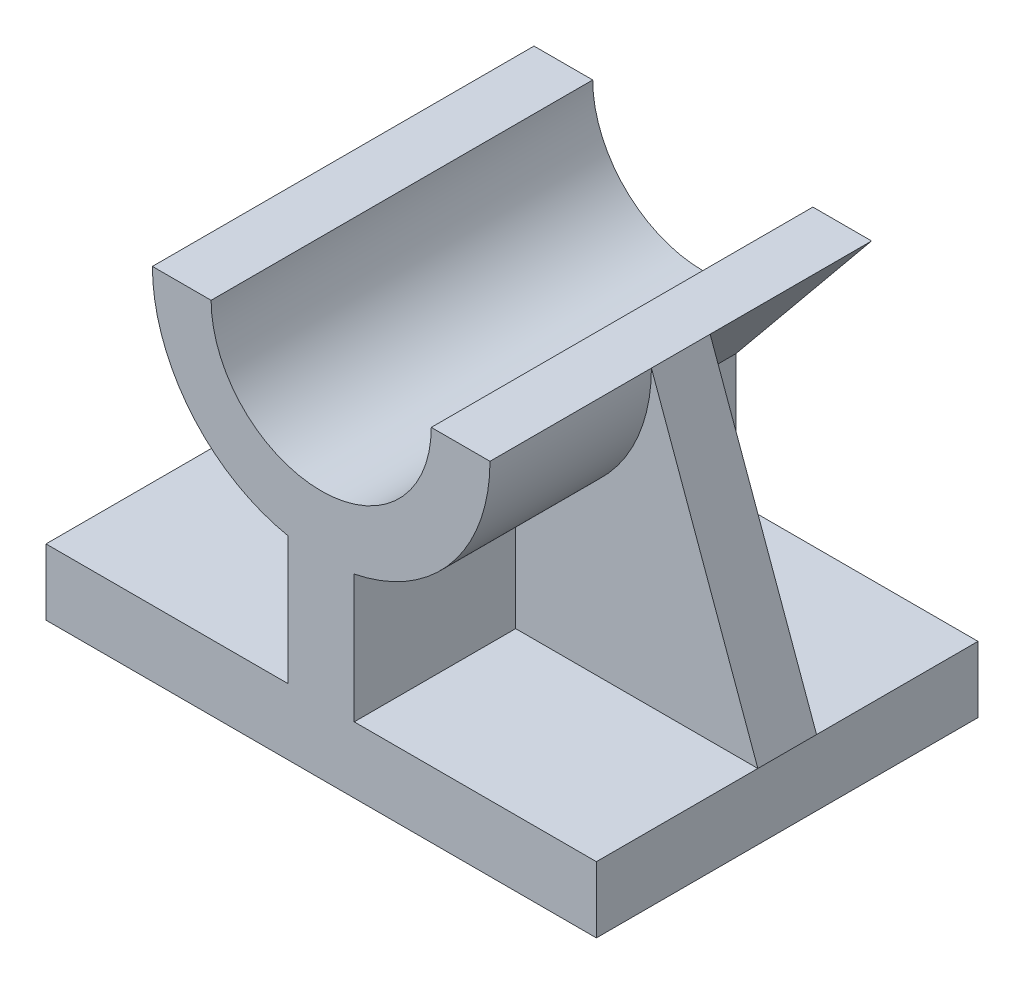
ISO-10303-21;
HEADER;
FILE_DESCRIPTION(('STEP AP214'),'2;1');
FILE_NAME('part.step','',(''),(''),'','','');
FILE_SCHEMA(('AUTOMOTIVE_DESIGN { 1 0 10303 214 1 1 1 1 }'));
ENDSEC;
DATA;
#1=APPLICATION_CONTEXT('core data for automotive mechanical design processes');
#2=APPLICATION_PROTOCOL_DEFINITION('international standard','automotive_design',2000,#1);
#3=PRODUCT_CONTEXT('',#1,'mechanical');
#4=PRODUCT('Part','Part','',(#3));
#5=PRODUCT_RELATED_PRODUCT_CATEGORY('part','',(#4));
#6=PRODUCT_DEFINITION_FORMATION('','',#4);
#7=PRODUCT_DEFINITION_CONTEXT('part definition',#1,'design');
#8=PRODUCT_DEFINITION('design','',#6,#7);
#9=PRODUCT_DEFINITION_SHAPE('','',#8);
#10=(LENGTH_UNIT() NAMED_UNIT(*) SI_UNIT(.MILLI.,.METRE.));
#11=(NAMED_UNIT(*) PLANE_ANGLE_UNIT() SI_UNIT($,.RADIAN.));
#12=(NAMED_UNIT(*) SI_UNIT($,.STERADIAN.) SOLID_ANGLE_UNIT());
#13=UNCERTAINTY_MEASURE_WITH_UNIT(LENGTH_MEASURE(1.E-05),#10,'distance_accuracy_value','');
#14=(GEOMETRIC_REPRESENTATION_CONTEXT(3) GLOBAL_UNCERTAINTY_ASSIGNED_CONTEXT((#13)) GLOBAL_UNIT_ASSIGNED_CONTEXT((#10,
#11,#12)) REPRESENTATION_CONTEXT('',''));
#15=CARTESIAN_POINT('',(0.,0.,0.));
#16=DIRECTION('',(0.,0.,1.));
#17=DIRECTION('',(1.,0.,0.));
#18=AXIS2_PLACEMENT_3D('',#15,#16,#17);
#19=CARTESIAN_POINT('',(0.,44.5,0.));
#20=DIRECTION('',(0.,0.,1.));
#21=DIRECTION('',(1.,0.,0.));
#22=AXIS2_PLACEMENT_3D('',#19,#20,#21);
#23=PLANE('',#22);
#24=DIRECTION('',(1.,0.,0.));
#25=VECTOR('',#24,1.);
#26=CARTESIAN_POINT('',(4.49999999999999,4.49999999999999,0.));
#27=LINE('',#26,#25);
#28=CARTESIAN_POINT('',(4.49999999999999,4.49999999999999,0.));
#29=VERTEX_POINT('',#28);
#30=CARTESIAN_POINT('',(37.5,4.49999999999999,0.));
#31=VERTEX_POINT('',#30);
#32=EDGE_CURVE('E175',#29,#31,#27,.T.);
#33=ORIENTED_EDGE('',*,*,#32,.T.);
#34=DIRECTION('',(0.,1.,0.));
#35=VECTOR('',#34,1.);
#36=CARTESIAN_POINT('',(37.5,4.49999999999999,0.));
#37=LINE('',#36,#35);
#38=CARTESIAN_POINT('',(37.5,-4.5,0.));
#39=VERTEX_POINT('',#38);
#40=EDGE_CURVE('E205',#39,#31,#37,.T.);
#41=ORIENTED_EDGE('',*,*,#40,.F.);
#42=DIRECTION('',(1.,0.,0.));
#43=VECTOR('',#42,1.);
#44=CARTESIAN_POINT('',(-37.5,-4.5,0.));
#45=LINE('',#44,#43);
#46=CARTESIAN_POINT('',(-37.5,-4.5,0.));
#47=VERTEX_POINT('',#46);
#48=EDGE_CURVE('E211',#47,#39,#45,.T.);
#49=ORIENTED_EDGE('',*,*,#48,.F.);
#50=DIRECTION('',(0.,-1.,0.));
#51=VECTOR('',#50,1.);
#52=CARTESIAN_POINT('',(-37.5,4.49999999999999,0.));
#53=LINE('',#52,#51);
#54=CARTESIAN_POINT('',(-37.5,4.49999999999999,0.));
#55=VERTEX_POINT('',#54);
#56=EDGE_CURVE('E266',#55,#47,#53,.T.);
#57=ORIENTED_EDGE('',*,*,#56,.F.);
#58=DIRECTION('',(-1.,0.,0.));
#59=VECTOR('',#58,1.);
#60=CARTESIAN_POINT('',(-37.5,4.49999999999999,0.));
#61=LINE('',#60,#59);
#62=CARTESIAN_POINT('',(-4.5,4.49999999999999,0.));
#63=VERTEX_POINT('',#62);
#64=EDGE_CURVE('E263',#63,#55,#61,.T.);
#65=ORIENTED_EDGE('',*,*,#64,.F.);
#66=DIRECTION('',(0.,-1.,0.));
#67=VECTOR('',#66,1.);
#68=CARTESIAN_POINT('',(-4.5,4.49999999999999,0.));
#69=LINE('',#68,#67);
#70=CARTESIAN_POINT('',(-4.5,21.9445128627201,0.));
#71=VERTEX_POINT('',#70);
#72=EDGE_CURVE('E260',#71,#63,#69,.T.);
#73=ORIENTED_EDGE('',*,*,#72,.F.);
#74=CARTESIAN_POINT('',(0.,44.5,0.));
#75=DIRECTION('',(0.,0.,1.));
#76=DIRECTION('',(1.,0.,0.));
#77=AXIS2_PLACEMENT_3D('',#74,#75,#76);
#78=CIRCLE('',#77,23.);
#79=CARTESIAN_POINT('',(-23.,44.4999999999998,0.));
#80=VERTEX_POINT('',#79);
#81=EDGE_CURVE('E257',#80,#71,#78,.T.);
#82=ORIENTED_EDGE('',*,*,#81,.F.);
#83=DIRECTION('',(-1.,0.,0.));
#84=VECTOR('',#83,1.);
#85=CARTESIAN_POINT('',(-23.,44.4999999999998,0.));
#86=LINE('',#85,#84);
#87=CARTESIAN_POINT('',(-15.,44.4999999999999,0.));
#88=VERTEX_POINT('',#87);
#89=EDGE_CURVE('E254',#88,#80,#86,.T.);
#90=ORIENTED_EDGE('',*,*,#89,.F.);
#91=CARTESIAN_POINT('',(0.,44.5,0.));
#92=DIRECTION('',(0.,0.,-1.));
#93=DIRECTION('',(1.,0.,0.));
#94=AXIS2_PLACEMENT_3D('',#91,#92,#93);
#95=CIRCLE('',#94,15.);
#96=CARTESIAN_POINT('',(15.,44.5,0.));
#97=VERTEX_POINT('',#96);
#98=EDGE_CURVE('E251',#97,#88,#95,.T.);
#99=ORIENTED_EDGE('',*,*,#98,.F.);
#100=DIRECTION('',(-1.,0.,0.));
#101=VECTOR('',#100,1.);
#102=CARTESIAN_POINT('',(15.,44.5,0.));
#103=LINE('',#102,#101);
#104=CARTESIAN_POINT('',(23.,44.5,0.));
#105=VERTEX_POINT('',#104);
#106=EDGE_CURVE('E248',#105,#97,#103,.T.);
#107=ORIENTED_EDGE('',*,*,#106,.F.);
#108=DIRECTION('',(-0.634171832426731,-0.773192141033858,0.));
#109=VECTOR('',#108,1.);
#110=CARTESIAN_POINT('',(23.,44.5,0.));
#111=LINE('',#110,#109);
#112=CARTESIAN_POINT('',(4.5,21.9445128627201,0.));
#113=VERTEX_POINT('',#112);
#114=EDGE_CURVE('E171',#105,#113,#111,.T.);
#115=ORIENTED_EDGE('',*,*,#114,.T.);
#116=DIRECTION('',(0.,-1.,0.));
#117=VECTOR('',#116,1.);
#118=CARTESIAN_POINT('',(4.5,21.9445128627201,0.));
#119=LINE('',#118,#117);
#120=EDGE_CURVE('E345',#113,#29,#119,.T.);
#121=ORIENTED_EDGE('',*,*,#120,.T.);
#122=EDGE_LOOP('',(#33,#41,#49,#57,#65,#73,#82,#90,#99,#107,#115,#121));
#123=FACE_BOUND('',#122,.T.);
#124=ADVANCED_FACE('F39',(#123),#23,.F.);
#125=CARTESIAN_POINT('',(37.5,4.49999999999999,52.));
#126=DIRECTION('',(-1.,0.,0.));
#127=DIRECTION('',(0.,0.,1.));
#128=AXIS2_PLACEMENT_3D('',#125,#126,#127);
#129=PLANE('',#128);
#130=ORIENTED_EDGE('',*,*,#40,.T.);
#131=DIRECTION('',(0.,0.,-1.));
#132=VECTOR('',#131,1.);
#133=CARTESIAN_POINT('',(37.5,4.49999999999999,22.));
#134=LINE('',#133,#132);
#135=CARTESIAN_POINT('',(37.5,4.49999999999999,22.));
#136=VERTEX_POINT('',#135);
#137=EDGE_CURVE('E178',#136,#31,#134,.T.);
#138=ORIENTED_EDGE('',*,*,#137,.F.);
#139=DIRECTION('',(0.,0.,-1.));
#140=VECTOR('',#139,1.);
#141=CARTESIAN_POINT('',(37.5,4.49999999999999,30.));
#142=LINE('',#141,#140);
#143=CARTESIAN_POINT('',(37.5,4.49999999999999,30.));
#144=VERTEX_POINT('',#143);
#145=EDGE_CURVE('E63',#144,#136,#142,.T.);
#146=ORIENTED_EDGE('',*,*,#145,.F.);
#147=DIRECTION('',(0.,0.,-1.));
#148=VECTOR('',#147,1.);
#149=CARTESIAN_POINT('',(37.5,4.49999999999999,52.));
#150=LINE('',#149,#148);
#151=CARTESIAN_POINT('',(37.5,4.49999999999999,52.));
#152=VERTEX_POINT('',#151);
#153=EDGE_CURVE('E11',#152,#144,#150,.T.);
#154=ORIENTED_EDGE('',*,*,#153,.F.);
#155=DIRECTION('',(0.,1.,0.));
#156=VECTOR('',#155,1.);
#157=CARTESIAN_POINT('',(37.5,4.49999999999999,52.));
#158=LINE('',#157,#156);
#159=CARTESIAN_POINT('',(37.5,-4.5,52.));
#160=VERTEX_POINT('',#159);
#161=EDGE_CURVE('E206',#160,#152,#158,.T.);
#162=ORIENTED_EDGE('',*,*,#161,.F.);
#163=DIRECTION('',(0.,0.,-1.));
#164=VECTOR('',#163,1.);
#165=CARTESIAN_POINT('',(37.5,-4.5,52.));
#166=LINE('',#165,#164);
#167=EDGE_CURVE('E244',#160,#39,#166,.T.);
#168=ORIENTED_EDGE('',*,*,#167,.T.);
#169=EDGE_LOOP('',(#130,#138,#146,#154,#162,#168));
#170=FACE_BOUND('',#169,.T.);
#171=ADVANCED_FACE('F41',(#170),#129,.F.);
#172=CARTESIAN_POINT('',(4.49999999999999,4.49999999999999,52.));
#173=DIRECTION('',(0.,-1.,0.));
#174=DIRECTION('',(0.,0.,-1.));
#175=AXIS2_PLACEMENT_3D('',#172,#173,#174);
#176=PLANE('',#175);
#177=ORIENTED_EDGE('',*,*,#153,.T.);
#178=DIRECTION('',(1.,0.,0.));
#179=VECTOR('',#178,1.);
#180=CARTESIAN_POINT('',(4.49999999999999,4.49999999999999,30.));
#181=LINE('',#180,#179);
#182=CARTESIAN_POINT('',(4.49999999999999,4.49999999999999,30.));
#183=VERTEX_POINT('',#182);
#184=EDGE_CURVE('E183',#183,#144,#181,.T.);
#185=ORIENTED_EDGE('',*,*,#184,.F.);
#186=DIRECTION('',(0.,0.,-1.));
#187=VECTOR('',#186,1.);
#188=CARTESIAN_POINT('',(4.49999999999999,4.49999999999999,52.));
#189=LINE('',#188,#187);
#190=CARTESIAN_POINT('',(4.49999999999999,4.49999999999999,52.));
#191=VERTEX_POINT('',#190);
#192=EDGE_CURVE('E48',#191,#183,#189,.T.);
#193=ORIENTED_EDGE('',*,*,#192,.F.);
#194=DIRECTION('',(-1.,0.,0.));
#195=VECTOR('',#194,1.);
#196=CARTESIAN_POINT('',(4.49999999999999,4.49999999999999,52.));
#197=LINE('',#196,#195);
#198=EDGE_CURVE('E210',#152,#191,#197,.T.);
#199=ORIENTED_EDGE('',*,*,#198,.F.);
#200=EDGE_LOOP('',(#177,#185,#193,#199));
#201=FACE_BOUND('',#200,.T.);
#202=ADVANCED_FACE('F336',(#201),#176,.F.);
#203=CARTESIAN_POINT('',(4.49999999999999,4.49999999999999,52.));
#204=DIRECTION('',(-1.,0.,0.));
#205=DIRECTION('',(0.,0.,1.));
#206=AXIS2_PLACEMENT_3D('',#203,#204,#205);
#207=PLANE('',#206);
#208=ORIENTED_EDGE('',*,*,#192,.T.);
#209=DIRECTION('',(0.,-1.,0.));
#210=VECTOR('',#209,1.);
#211=CARTESIAN_POINT('',(4.5,21.9445128627201,30.));
#212=LINE('',#211,#210);
#213=CARTESIAN_POINT('',(4.5,21.9445128627201,30.));
#214=VERTEX_POINT('',#213);
#215=EDGE_CURVE('E177',#214,#183,#212,.T.);
#216=ORIENTED_EDGE('',*,*,#215,.F.);
#217=DIRECTION('',(0.,0.,-1.));
#218=VECTOR('',#217,1.);
#219=CARTESIAN_POINT('',(4.5,21.9445128627201,52.));
#220=LINE('',#219,#218);
#221=CARTESIAN_POINT('',(4.5,21.9445128627201,52.));
#222=VERTEX_POINT('',#221);
#223=EDGE_CURVE('E306',#222,#214,#220,.T.);
#224=ORIENTED_EDGE('',*,*,#223,.F.);
#225=DIRECTION('',(0.,1.,0.));
#226=VECTOR('',#225,1.);
#227=CARTESIAN_POINT('',(4.49999999999999,4.49999999999999,52.));
#228=LINE('',#227,#226);
#229=EDGE_CURVE('E214',#191,#222,#228,.T.);
#230=ORIENTED_EDGE('',*,*,#229,.F.);
#231=EDGE_LOOP('',(#208,#216,#224,#230));
#232=FACE_BOUND('',#231,.T.);
#233=ADVANCED_FACE('F314',(#232),#207,.F.);
#234=CARTESIAN_POINT('',(0.,44.5,52.));
#235=DIRECTION('',(0.,0.,-1.));
#236=DIRECTION('',(-1.,0.,0.));
#237=AXIS2_PLACEMENT_3D('',#234,#235,#236);
#238=CYLINDRICAL_SURFACE('',#237,23.);
#239=ORIENTED_EDGE('',*,*,#223,.T.);
#240=CARTESIAN_POINT('',(0.,44.5,30.));
#241=DIRECTION('',(0.,0.,1.));
#242=DIRECTION('',(1.,0.,0.));
#243=AXIS2_PLACEMENT_3D('',#240,#241,#242);
#244=CIRCLE('',#243,23.);
#245=CARTESIAN_POINT('',(23.,44.5,30.));
#246=VERTEX_POINT('',#245);
#247=EDGE_CURVE('E202',#214,#246,#244,.T.);
#248=ORIENTED_EDGE('',*,*,#247,.T.);
#249=DIRECTION('',(0.,0.,-1.));
#250=VECTOR('',#249,1.);
#251=CARTESIAN_POINT('',(23.,44.5,52.));
#252=LINE('',#251,#250);
#253=CARTESIAN_POINT('',(23.,44.5,52.));
#254=VERTEX_POINT('',#253);
#255=EDGE_CURVE('E302',#254,#246,#252,.T.);
#256=ORIENTED_EDGE('',*,*,#255,.F.);
#257=CARTESIAN_POINT('',(0.,44.5,52.));
#258=DIRECTION('',(0.,0.,1.));
#259=DIRECTION('',(1.,0.,0.));
#260=AXIS2_PLACEMENT_3D('',#257,#258,#259);
#261=CIRCLE('',#260,23.);
#262=EDGE_CURVE('E217',#222,#254,#261,.T.);
#263=ORIENTED_EDGE('',*,*,#262,.F.);
#264=EDGE_LOOP('',(#239,#248,#256,#263));
#265=FACE_BOUND('',#264,.T.);
#266=ADVANCED_FACE('F324',(#265),#238,.T.);
#267=CARTESIAN_POINT('',(15.,44.5,52.));
#268=DIRECTION('',(0.,-1.,0.));
#269=DIRECTION('',(1.,0.,0.));
#270=AXIS2_PLACEMENT_3D('',#267,#268,#269);
#271=PLANE('',#270);
#272=ORIENTED_EDGE('',*,*,#106,.T.);
#273=DIRECTION('',(0.,0.,-1.));
#274=VECTOR('',#273,1.);
#275=CARTESIAN_POINT('',(15.,44.5,52.));
#276=LINE('',#275,#274);
#277=CARTESIAN_POINT('',(15.,44.5,52.));
#278=VERTEX_POINT('',#277);
#279=EDGE_CURVE('E298',#278,#97,#276,.T.);
#280=ORIENTED_EDGE('',*,*,#279,.F.);
#281=DIRECTION('',(-1.,0.,0.));
#282=VECTOR('',#281,1.);
#283=CARTESIAN_POINT('',(15.,44.5,52.));
#284=LINE('',#283,#282);
#285=EDGE_CURVE('E220',#254,#278,#284,.T.);
#286=ORIENTED_EDGE('',*,*,#285,.F.);
#287=ORIENTED_EDGE('',*,*,#255,.T.);
#288=DIRECTION('',(0.,0.,-1.));
#289=VECTOR('',#288,1.);
#290=CARTESIAN_POINT('',(23.,44.5,30.));
#291=LINE('',#290,#289);
#292=CARTESIAN_POINT('',(23.,44.5,22.));
#293=VERTEX_POINT('',#292);
#294=EDGE_CURVE('E196',#246,#293,#291,.T.);
#295=ORIENTED_EDGE('',*,*,#294,.T.);
#296=DIRECTION('',(0.,0.,-1.));
#297=VECTOR('',#296,1.);
#298=CARTESIAN_POINT('',(23.,44.5,22.));
#299=LINE('',#298,#297);
#300=EDGE_CURVE('E185',#293,#105,#299,.T.);
#301=ORIENTED_EDGE('',*,*,#300,.T.);
#302=EDGE_LOOP('',(#272,#280,#286,#287,#295,#301));
#303=FACE_BOUND('',#302,.T.);
#304=ADVANCED_FACE('F328',(#303),#271,.F.);
#305=CARTESIAN_POINT('',(0.,44.5,52.));
#306=DIRECTION('',(0.,0.,-1.));
#307=DIRECTION('',(-1.,0.,0.));
#308=AXIS2_PLACEMENT_3D('',#305,#306,#307);
#309=CYLINDRICAL_SURFACE('',#308,15.);
#310=ORIENTED_EDGE('',*,*,#98,.T.);
#311=DIRECTION('',(0.,0.,-1.));
#312=VECTOR('',#311,1.);
#313=CARTESIAN_POINT('',(-15.,44.4999999999999,52.));
#314=LINE('',#313,#312);
#315=CARTESIAN_POINT('',(-15.,44.4999999999999,52.));
#316=VERTEX_POINT('',#315);
#317=EDGE_CURVE('E294',#316,#88,#314,.T.);
#318=ORIENTED_EDGE('',*,*,#317,.F.);
#319=CARTESIAN_POINT('',(0.,44.5,52.));
#320=DIRECTION('',(0.,0.,-1.));
#321=DIRECTION('',(1.,0.,0.));
#322=AXIS2_PLACEMENT_3D('',#319,#320,#321);
#323=CIRCLE('',#322,15.);
#324=EDGE_CURVE('E223',#278,#316,#323,.T.);
#325=ORIENTED_EDGE('',*,*,#324,.F.);
#326=ORIENTED_EDGE('',*,*,#279,.T.);
#327=EDGE_LOOP('',(#310,#318,#325,#326));
#328=FACE_BOUND('',#327,.T.);
#329=ADVANCED_FACE('F362',(#328),#309,.F.);
#330=CARTESIAN_POINT('',(-23.,44.4999999999998,52.));
#331=DIRECTION('',(0.,-1.,0.));
#332=DIRECTION('',(1.,0.,0.));
#333=AXIS2_PLACEMENT_3D('',#330,#331,#332);
#334=PLANE('',#333);
#335=ORIENTED_EDGE('',*,*,#89,.T.);
#336=DIRECTION('',(0.,0.,-1.));
#337=VECTOR('',#336,1.);
#338=CARTESIAN_POINT('',(-23.,44.4999999999998,52.));
#339=LINE('',#338,#337);
#340=CARTESIAN_POINT('',(-23.,44.4999999999998,52.));
#341=VERTEX_POINT('',#340);
#342=EDGE_CURVE('E290',#341,#80,#339,.T.);
#343=ORIENTED_EDGE('',*,*,#342,.F.);
#344=DIRECTION('',(-1.,0.,0.));
#345=VECTOR('',#344,1.);
#346=CARTESIAN_POINT('',(-23.,44.4999999999998,52.));
#347=LINE('',#346,#345);
#348=EDGE_CURVE('E226',#316,#341,#347,.T.);
#349=ORIENTED_EDGE('',*,*,#348,.F.);
#350=ORIENTED_EDGE('',*,*,#317,.T.);
#351=EDGE_LOOP('',(#335,#343,#349,#350));
#352=FACE_BOUND('',#351,.T.);
#353=ADVANCED_FACE('F365',(#352),#334,.F.);
#354=CARTESIAN_POINT('',(0.,44.5,52.));
#355=DIRECTION('',(0.,0.,-1.));
#356=DIRECTION('',(-1.,0.,0.));
#357=AXIS2_PLACEMENT_3D('',#354,#355,#356);
#358=CYLINDRICAL_SURFACE('',#357,23.);
#359=ORIENTED_EDGE('',*,*,#81,.T.);
#360=DIRECTION('',(0.,0.,-1.));
#361=VECTOR('',#360,1.);
#362=CARTESIAN_POINT('',(-4.5,21.9445128627201,52.));
#363=LINE('',#362,#361);
#364=CARTESIAN_POINT('',(-4.5,21.9445128627201,52.));
#365=VERTEX_POINT('',#364);
#366=EDGE_CURVE('E286',#365,#71,#363,.T.);
#367=ORIENTED_EDGE('',*,*,#366,.F.);
#368=CARTESIAN_POINT('',(0.,44.5,52.));
#369=DIRECTION('',(0.,0.,1.));
#370=DIRECTION('',(1.,0.,0.));
#371=AXIS2_PLACEMENT_3D('',#368,#369,#370);
#372=CIRCLE('',#371,23.);
#373=EDGE_CURVE('E229',#341,#365,#372,.T.);
#374=ORIENTED_EDGE('',*,*,#373,.F.);
#375=ORIENTED_EDGE('',*,*,#342,.T.);
#376=EDGE_LOOP('',(#359,#367,#374,#375));
#377=FACE_BOUND('',#376,.T.);
#378=ADVANCED_FACE('F372',(#377),#358,.T.);
#379=CARTESIAN_POINT('',(-4.5,4.49999999999999,52.));
#380=DIRECTION('',(1.,0.,0.));
#381=DIRECTION('',(0.,0.,-1.));
#382=AXIS2_PLACEMENT_3D('',#379,#380,#381);
#383=PLANE('',#382);
#384=ORIENTED_EDGE('',*,*,#72,.T.);
#385=DIRECTION('',(0.,0.,-1.));
#386=VECTOR('',#385,1.);
#387=CARTESIAN_POINT('',(-4.5,4.49999999999999,52.));
#388=LINE('',#387,#386);
#389=CARTESIAN_POINT('',(-4.5,4.49999999999999,52.));
#390=VERTEX_POINT('',#389);
#391=EDGE_CURVE('E282',#390,#63,#388,.T.);
#392=ORIENTED_EDGE('',*,*,#391,.F.);
#393=DIRECTION('',(0.,-1.,0.));
#394=VECTOR('',#393,1.);
#395=CARTESIAN_POINT('',(-4.5,4.49999999999999,52.));
#396=LINE('',#395,#394);
#397=EDGE_CURVE('E232',#365,#390,#396,.T.);
#398=ORIENTED_EDGE('',*,*,#397,.F.);
#399=ORIENTED_EDGE('',*,*,#366,.T.);
#400=EDGE_LOOP('',(#384,#392,#398,#399));
#401=FACE_BOUND('',#400,.T.);
#402=ADVANCED_FACE('F375',(#401),#383,.F.);
#403=CARTESIAN_POINT('',(-37.5,4.49999999999999,52.));
#404=DIRECTION('',(0.,-1.,0.));
#405=DIRECTION('',(0.,0.,-1.));
#406=AXIS2_PLACEMENT_3D('',#403,#404,#405);
#407=PLANE('',#406);
#408=ORIENTED_EDGE('',*,*,#64,.T.);
#409=DIRECTION('',(0.,0.,-1.));
#410=VECTOR('',#409,1.);
#411=CARTESIAN_POINT('',(-37.5,4.49999999999999,52.));
#412=LINE('',#411,#410);
#413=CARTESIAN_POINT('',(-37.5,4.49999999999999,52.));
#414=VERTEX_POINT('',#413);
#415=EDGE_CURVE('E278',#414,#55,#412,.T.);
#416=ORIENTED_EDGE('',*,*,#415,.F.);
#417=DIRECTION('',(-1.,0.,0.));
#418=VECTOR('',#417,1.);
#419=CARTESIAN_POINT('',(-37.5,4.49999999999999,52.));
#420=LINE('',#419,#418);
#421=EDGE_CURVE('E235',#390,#414,#420,.T.);
#422=ORIENTED_EDGE('',*,*,#421,.F.);
#423=ORIENTED_EDGE('',*,*,#391,.T.);
#424=EDGE_LOOP('',(#408,#416,#422,#423));
#425=FACE_BOUND('',#424,.T.);
#426=ADVANCED_FACE('F380',(#425),#407,.F.);
#427=CARTESIAN_POINT('',(-37.5,4.49999999999999,52.));
#428=DIRECTION('',(1.,0.,0.));
#429=DIRECTION('',(0.,0.,-1.));
#430=AXIS2_PLACEMENT_3D('',#427,#428,#429);
#431=PLANE('',#430);
#432=ORIENTED_EDGE('',*,*,#56,.T.);
#433=DIRECTION('',(0.,0.,-1.));
#434=VECTOR('',#433,1.);
#435=CARTESIAN_POINT('',(-37.5,-4.5,52.));
#436=LINE('',#435,#434);
#437=CARTESIAN_POINT('',(-37.5,-4.5,52.));
#438=VERTEX_POINT('',#437);
#439=EDGE_CURVE('E274',#438,#47,#436,.T.);
#440=ORIENTED_EDGE('',*,*,#439,.F.);
#441=DIRECTION('',(0.,-1.,0.));
#442=VECTOR('',#441,1.);
#443=CARTESIAN_POINT('',(-37.5,4.49999999999999,52.));
#444=LINE('',#443,#442);
#445=EDGE_CURVE('E238',#414,#438,#444,.T.);
#446=ORIENTED_EDGE('',*,*,#445,.F.);
#447=ORIENTED_EDGE('',*,*,#415,.T.);
#448=EDGE_LOOP('',(#432,#440,#446,#447));
#449=FACE_BOUND('',#448,.T.);
#450=ADVANCED_FACE('F384',(#449),#431,.F.);
#451=CARTESIAN_POINT('',(-37.5,-4.5,52.));
#452=DIRECTION('',(0.,1.,0.));
#453=DIRECTION('',(0.,0.,1.));
#454=AXIS2_PLACEMENT_3D('',#451,#452,#453);
#455=PLANE('',#454);
#456=ORIENTED_EDGE('',*,*,#48,.T.);
#457=ORIENTED_EDGE('',*,*,#167,.F.);
#458=DIRECTION('',(1.,0.,0.));
#459=VECTOR('',#458,1.);
#460=CARTESIAN_POINT('',(-37.5,-4.5,52.));
#461=LINE('',#460,#459);
#462=EDGE_CURVE('E241',#438,#160,#461,.T.);
#463=ORIENTED_EDGE('',*,*,#462,.F.);
#464=ORIENTED_EDGE('',*,*,#439,.T.);
#465=EDGE_LOOP('',(#456,#457,#463,#464));
#466=FACE_BOUND('',#465,.T.);
#467=ADVANCED_FACE('F385',(#466),#455,.F.);
#468=CARTESIAN_POINT('',(0.,44.5,52.));
#469=DIRECTION('',(0.,0.,1.));
#470=DIRECTION('',(1.,0.,0.));
#471=AXIS2_PLACEMENT_3D('',#468,#469,#470);
#472=PLANE('',#471);
#473=ORIENTED_EDGE('',*,*,#161,.T.);
#474=ORIENTED_EDGE('',*,*,#198,.T.);
#475=ORIENTED_EDGE('',*,*,#229,.T.);
#476=ORIENTED_EDGE('',*,*,#262,.T.);
#477=ORIENTED_EDGE('',*,*,#285,.T.);
#478=ORIENTED_EDGE('',*,*,#324,.T.);
#479=ORIENTED_EDGE('',*,*,#348,.T.);
#480=ORIENTED_EDGE('',*,*,#373,.T.);
#481=ORIENTED_EDGE('',*,*,#397,.T.);
#482=ORIENTED_EDGE('',*,*,#421,.T.);
#483=ORIENTED_EDGE('',*,*,#445,.T.);
#484=ORIENTED_EDGE('',*,*,#462,.T.);
#485=EDGE_LOOP('',(#473,#474,#475,#476,#477,#478,#479,#480,#481,#482,#483,#484));
#486=FACE_BOUND('',#485,.T.);
#487=ADVANCED_FACE('F333',(#486),#472,.T.);
#488=CARTESIAN_POINT('',(0.,0.,30.));
#489=DIRECTION('',(0.,0.,1.));
#490=DIRECTION('',(1.,0.,0.));
#491=AXIS2_PLACEMENT_3D('',#488,#489,#490);
#492=PLANE('',#491);
#493=ORIENTED_EDGE('',*,*,#247,.F.);
#494=ORIENTED_EDGE('',*,*,#215,.T.);
#495=ORIENTED_EDGE('',*,*,#184,.T.);
#496=DIRECTION('',(-0.3407993236214,0.940136065162483,0.));
#497=VECTOR('',#496,1.);
#498=CARTESIAN_POINT('',(37.5,4.49999999999999,30.));
#499=LINE('',#498,#497);
#500=EDGE_CURVE('E192',#144,#246,#499,.T.);
#501=ORIENTED_EDGE('',*,*,#500,.T.);
#502=EDGE_LOOP('',(#493,#494,#495,#501));
#503=FACE_BOUND('',#502,.T.);
#504=ADVANCED_FACE('F319',(#503),#492,.T.);
#505=CARTESIAN_POINT('',(37.5,4.49999999999999,30.));
#506=DIRECTION('',(-0.940136065162483,-0.3407993236214,0.));
#507=DIRECTION('',(0.3407993236214,-0.940136065162483,0.));
#508=AXIS2_PLACEMENT_3D('',#505,#506,#507);
#509=PLANE('',#508);
#510=ORIENTED_EDGE('',*,*,#145,.T.);
#511=DIRECTION('',(-0.3407993236214,0.940136065162483,0.));
#512=VECTOR('',#511,1.);
#513=CARTESIAN_POINT('',(37.5,4.49999999999999,22.));
#514=LINE('',#513,#512);
#515=EDGE_CURVE('E157',#136,#293,#514,.T.);
#516=ORIENTED_EDGE('',*,*,#515,.T.);
#517=ORIENTED_EDGE('',*,*,#294,.F.);
#518=ORIENTED_EDGE('',*,*,#500,.F.);
#519=EDGE_LOOP('',(#510,#516,#517,#518));
#520=FACE_BOUND('',#519,.T.);
#521=ADVANCED_FACE('F400',(#520),#509,.F.);
#522=CARTESIAN_POINT('',(4.5,21.9445128627201,22.));
#523=DIRECTION('',(1.,0.,0.));
#524=DIRECTION('',(0.,1.,0.));
#525=AXIS2_PLACEMENT_3D('',#522,#523,#524);
#526=PLANE('',#525);
#527=ORIENTED_EDGE('',*,*,#120,.F.);
#528=DIRECTION('',(0.,0.,-1.));
#529=VECTOR('',#528,1.);
#530=CARTESIAN_POINT('',(4.5,21.9445128627201,22.));
#531=LINE('',#530,#529);
#532=CARTESIAN_POINT('',(4.5,21.9445128627201,22.));
#533=VERTEX_POINT('',#532);
#534=EDGE_CURVE('E169',#533,#113,#531,.T.);
#535=ORIENTED_EDGE('',*,*,#534,.F.);
#536=DIRECTION('',(0.,-1.,0.));
#537=VECTOR('',#536,1.);
#538=CARTESIAN_POINT('',(4.5,21.9445128627201,22.));
#539=LINE('',#538,#537);
#540=CARTESIAN_POINT('',(4.49999999999999,4.49999999999999,22.));
#541=VERTEX_POINT('',#540);
#542=EDGE_CURVE('E155',#533,#541,#539,.T.);
#543=ORIENTED_EDGE('',*,*,#542,.T.);
#544=DIRECTION('',(0.,0.,-1.));
#545=VECTOR('',#544,1.);
#546=CARTESIAN_POINT('',(4.49999999999999,4.49999999999999,22.));
#547=LINE('',#546,#545);
#548=EDGE_CURVE('E167',#541,#29,#547,.T.);
#549=ORIENTED_EDGE('',*,*,#548,.T.);
#550=EDGE_LOOP('',(#527,#535,#543,#549));
#551=FACE_BOUND('',#550,.T.);
#552=ADVANCED_FACE('F166',(#551),#526,.T.);
#553=CARTESIAN_POINT('',(4.49999999999999,4.49999999999999,22.));
#554=DIRECTION('',(0.,1.,0.));
#555=DIRECTION('',(0.,0.,1.));
#556=AXIS2_PLACEMENT_3D('',#553,#554,#555);
#557=PLANE('',#556);
#558=ORIENTED_EDGE('',*,*,#32,.F.);
#559=ORIENTED_EDGE('',*,*,#548,.F.);
#560=DIRECTION('',(1.,0.,0.));
#561=VECTOR('',#560,1.);
#562=CARTESIAN_POINT('',(4.49999999999999,4.49999999999999,22.));
#563=LINE('',#562,#561);
#564=EDGE_CURVE('E152',#541,#136,#563,.T.);
#565=ORIENTED_EDGE('',*,*,#564,.T.);
#566=ORIENTED_EDGE('',*,*,#137,.T.);
#567=EDGE_LOOP('',(#558,#559,#565,#566));
#568=FACE_BOUND('',#567,.T.);
#569=ADVANCED_FACE('F173',(#568),#557,.T.);
#570=CARTESIAN_POINT('',(23.,44.5,22.));
#571=DIRECTION('',(0.773192141033858,-0.634171832426731,0.));
#572=DIRECTION('',(0.634171832426731,0.773192141033858,0.));
#573=AXIS2_PLACEMENT_3D('',#570,#571,#572);
#574=PLANE('',#573);
#575=ORIENTED_EDGE('',*,*,#114,.F.);
#576=ORIENTED_EDGE('',*,*,#300,.F.);
#577=DIRECTION('',(-0.634171832426731,-0.773192141033858,0.));
#578=VECTOR('',#577,1.);
#579=CARTESIAN_POINT('',(23.,44.5,22.));
#580=LINE('',#579,#578);
#581=EDGE_CURVE('E55',#293,#533,#580,.T.);
#582=ORIENTED_EDGE('',*,*,#581,.T.);
#583=ORIENTED_EDGE('',*,*,#534,.T.);
#584=EDGE_LOOP('',(#575,#576,#582,#583));
#585=FACE_BOUND('',#584,.T.);
#586=ADVANCED_FACE('F410',(#585),#574,.T.);
#587=CARTESIAN_POINT('',(0.,0.,22.));
#588=DIRECTION('',(0.,0.,1.));
#589=DIRECTION('',(1.,0.,0.));
#590=AXIS2_PLACEMENT_3D('',#587,#588,#589);
#591=PLANE('',#590);
#592=ORIENTED_EDGE('',*,*,#542,.F.);
#593=ORIENTED_EDGE('',*,*,#581,.F.);
#594=ORIENTED_EDGE('',*,*,#515,.F.);
#595=ORIENTED_EDGE('',*,*,#564,.F.);
#596=EDGE_LOOP('',(#592,#593,#594,#595));
#597=FACE_BOUND('',#596,.T.);
#598=ADVANCED_FACE('F154',(#597),#591,.F.);
#599=CLOSED_SHELL('',(#124,#171,#202,#233,#266,#304,#329,#353,#378,#402,#426,#450,#467,#487,
#504,#521,#552,#569,#586,#598));
#600=MANIFOLD_SOLID_BREP('B2',#599);
#601=ADVANCED_BREP_SHAPE_REPRESENTATION('',(#18,#600),#14);
#602=SHAPE_DEFINITION_REPRESENTATION(#9,#601);
ENDSEC;
END-ISO-10303-21;
